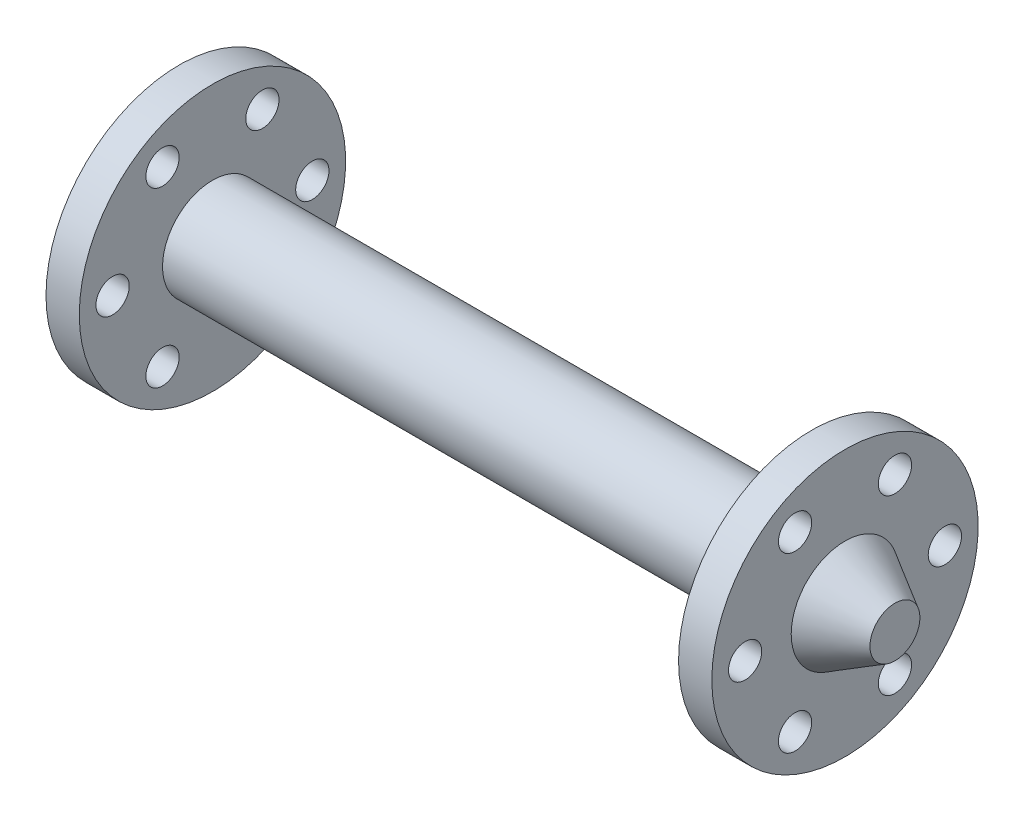
ISO-10303-21;
HEADER;
FILE_DESCRIPTION(('STEP AP214'),'2;1');
FILE_NAME('part.step','',(''),(''),'','','');
FILE_SCHEMA(('AUTOMOTIVE_DESIGN { 1 0 10303 214 1 1 1 1 }'));
ENDSEC;
DATA;
#1=APPLICATION_CONTEXT('core data for automotive mechanical design processes');
#2=APPLICATION_PROTOCOL_DEFINITION('international standard','automotive_design',2000,#1);
#3=PRODUCT_CONTEXT('',#1,'mechanical');
#4=PRODUCT('Part','Part','',(#3));
#5=PRODUCT_RELATED_PRODUCT_CATEGORY('part','',(#4));
#6=PRODUCT_DEFINITION_FORMATION('','',#4);
#7=PRODUCT_DEFINITION_CONTEXT('part definition',#1,'design');
#8=PRODUCT_DEFINITION('design','',#6,#7);
#9=PRODUCT_DEFINITION_SHAPE('','',#8);
#10=(LENGTH_UNIT() NAMED_UNIT(*) SI_UNIT(.MILLI.,.METRE.));
#11=(NAMED_UNIT(*) PLANE_ANGLE_UNIT() SI_UNIT($,.RADIAN.));
#12=(NAMED_UNIT(*) SI_UNIT($,.STERADIAN.) SOLID_ANGLE_UNIT());
#13=UNCERTAINTY_MEASURE_WITH_UNIT(LENGTH_MEASURE(1.E-05),#10,'distance_accuracy_value','');
#14=(GEOMETRIC_REPRESENTATION_CONTEXT(3) GLOBAL_UNCERTAINTY_ASSIGNED_CONTEXT((#13)) GLOBAL_UNIT_ASSIGNED_CONTEXT((#10,
#11,#12)) REPRESENTATION_CONTEXT('',''));
#15=CARTESIAN_POINT('',(0.,0.,0.));
#16=DIRECTION('',(0.,0.,1.));
#17=DIRECTION('',(1.,0.,0.));
#18=AXIS2_PLACEMENT_3D('',#15,#16,#17);
#19=CARTESIAN_POINT('',(-230.,0.,0.));
#20=DIRECTION('',(-1.,0.,0.));
#21=DIRECTION('',(0.,0.,1.));
#22=AXIS2_PLACEMENT_3D('',#19,#20,#21);
#23=PLANE('',#22);
#24=CARTESIAN_POINT('',(-230.,0.,0.));
#25=DIRECTION('',(-1.,0.,0.));
#26=DIRECTION('',(0.,0.,1.));
#27=AXIS2_PLACEMENT_3D('',#24,#25,#26);
#28=CIRCLE('',#27,15.);
#29=CARTESIAN_POINT('',(-230.,0.,15.));
#30=VERTEX_POINT('',#29);
#31=EDGE_CURVE('E10',#30,#30,#28,.T.);
#32=ORIENTED_EDGE('',*,*,#31,.T.);
#33=EDGE_LOOP('',(#32));
#34=FACE_BOUND('',#33,.T.);
#35=ADVANCED_FACE('F42',(#34),#23,.T.);
#36=CARTESIAN_POINT('',(-230.,0.,0.));
#37=DIRECTION('',(1.,0.,0.));
#38=DIRECTION('',(0.,0.,-1.));
#39=AXIS2_PLACEMENT_3D('',#36,#37,#38);
#40=CONICAL_SURFACE('',#39,15.,0.5235987755983);
#41=CARTESIAN_POINT('',(-199.996233933162,0.,0.));
#42=DIRECTION('',(-1.,0.,0.));
#43=DIRECTION('',(0.,0.,1.));
#44=AXIS2_PLACEMENT_3D('',#41,#42,#43);
#45=CIRCLE('',#44,32.3226824153916);
#46=CARTESIAN_POINT('',(-199.996233933162,0.,32.3226824153916));
#47=VERTEX_POINT('',#46);
#48=EDGE_CURVE('E50',#47,#47,#45,.T.);
#49=ORIENTED_EDGE('',*,*,#48,.T.);
#50=EDGE_LOOP('',(#49));
#51=FACE_BOUND('',#50,.T.);
#52=ORIENTED_EDGE('',*,*,#31,.F.);
#53=EDGE_LOOP('',(#52));
#54=FACE_BOUND('',#53,.T.);
#55=ADVANCED_FACE('F163',(#51,#54),#40,.T.);
#56=CARTESIAN_POINT('',(-199.996233933162,0.,0.));
#57=DIRECTION('',(-1.,0.,0.));
#58=DIRECTION('',(0.,0.,1.));
#59=AXIS2_PLACEMENT_3D('',#56,#57,#58);
#60=PLANE('',#59);
#61=CARTESIAN_POINT('',(-199.996233933162,0.,-60.));
#62=DIRECTION('',(-1.,0.,0.));
#63=DIRECTION('',(0.,0.,1.));
#64=AXIS2_PLACEMENT_3D('',#61,#62,#63);
#65=CIRCLE('',#64,10.);
#66=CARTESIAN_POINT('',(-199.996233933162,0.,-50.));
#67=VERTEX_POINT('',#66);
#68=EDGE_CURVE('E65',#67,#67,#65,.T.);
#69=ORIENTED_EDGE('',*,*,#68,.F.);
#70=EDGE_LOOP('',(#69));
#71=FACE_BOUND('',#70,.T.);
#72=CARTESIAN_POINT('',(-199.996233933162,-51.961524227066,-30.0000000000006));
#73=DIRECTION('',(-1.,0.,0.));
#74=DIRECTION('',(0.,0.,1.));
#75=AXIS2_PLACEMENT_3D('',#72,#73,#74);
#76=CIRCLE('',#75,10.);
#77=CARTESIAN_POINT('',(-199.996233933162,-51.961524227066,-20.0000000000006));
#78=VERTEX_POINT('',#77);
#79=EDGE_CURVE('E380',#78,#78,#76,.T.);
#80=ORIENTED_EDGE('',*,*,#79,.F.);
#81=EDGE_LOOP('',(#80));
#82=FACE_BOUND('',#81,.T.);
#83=CARTESIAN_POINT('',(-199.996233933162,-51.9615242270666,29.9999999999995));
#84=DIRECTION('',(-1.,0.,0.));
#85=DIRECTION('',(0.,0.,1.));
#86=AXIS2_PLACEMENT_3D('',#83,#84,#85);
#87=CIRCLE('',#86,10.);
#88=CARTESIAN_POINT('',(-199.996233933162,-51.9615242270666,39.9999999999995));
#89=VERTEX_POINT('',#88);
#90=EDGE_CURVE('E383',#89,#89,#87,.T.);
#91=ORIENTED_EDGE('',*,*,#90,.F.);
#92=EDGE_LOOP('',(#91));
#93=FACE_BOUND('',#92,.T.);
#94=CARTESIAN_POINT('',(-199.996233933162,-4.18977760661176E-13,60.));
#95=DIRECTION('',(-1.,0.,0.));
#96=DIRECTION('',(0.,0.,1.));
#97=AXIS2_PLACEMENT_3D('',#94,#95,#96);
#98=CIRCLE('',#97,10.);
#99=CARTESIAN_POINT('',(-199.996233933162,-4.18977760661176E-13,70.));
#100=VERTEX_POINT('',#99);
#101=EDGE_CURVE('E388',#100,#100,#98,.T.);
#102=ORIENTED_EDGE('',*,*,#101,.F.);
#103=EDGE_LOOP('',(#102));
#104=FACE_BOUND('',#103,.T.);
#105=CARTESIAN_POINT('',(-199.996233933162,51.9615242270662,30.0000000000002));
#106=DIRECTION('',(-1.,0.,0.));
#107=DIRECTION('',(0.,0.,1.));
#108=AXIS2_PLACEMENT_3D('',#105,#106,#107);
#109=CIRCLE('',#108,10.);
#110=CARTESIAN_POINT('',(-199.996233933162,51.9615242270662,40.0000000000002));
#111=VERTEX_POINT('',#110);
#112=EDGE_CURVE('E377',#111,#111,#109,.T.);
#113=ORIENTED_EDGE('',*,*,#112,.F.);
#114=EDGE_LOOP('',(#113));
#115=FACE_BOUND('',#114,.T.);
#116=CARTESIAN_POINT('',(-199.996233933162,51.9615242270664,-29.9999999999999));
#117=DIRECTION('',(-1.,0.,0.));
#118=DIRECTION('',(0.,0.,1.));
#119=AXIS2_PLACEMENT_3D('',#116,#117,#118);
#120=CIRCLE('',#119,10.);
#121=CARTESIAN_POINT('',(-199.996233933162,51.9615242270664,-19.9999999999999));
#122=VERTEX_POINT('',#121);
#123=EDGE_CURVE('E373',#122,#122,#120,.T.);
#124=ORIENTED_EDGE('',*,*,#123,.F.);
#125=EDGE_LOOP('',(#124));
#126=FACE_BOUND('',#125,.T.);
#127=CARTESIAN_POINT('',(-199.996233933162,0.,0.));
#128=DIRECTION('',(-1.,0.,0.));
#129=DIRECTION('',(0.,0.,1.));
#130=AXIS2_PLACEMENT_3D('',#127,#128,#129);
#131=CIRCLE('',#130,80.);
#132=CARTESIAN_POINT('',(-199.996233933162,0.,80.));
#133=VERTEX_POINT('',#132);
#134=EDGE_CURVE('E56',#133,#133,#131,.T.);
#135=ORIENTED_EDGE('',*,*,#134,.T.);
#136=EDGE_LOOP('',(#135));
#137=FACE_BOUND('',#136,.T.);
#138=ORIENTED_EDGE('',*,*,#48,.F.);
#139=EDGE_LOOP('',(#138));
#140=FACE_BOUND('',#139,.T.);
#141=ADVANCED_FACE('F146',(#71,#82,#93,#104,#115,#126,#137,#140),#60,.T.);
#142=CARTESIAN_POINT('',(-230.,0.,0.));
#143=DIRECTION('',(-1.,0.,0.));
#144=DIRECTION('',(0.,0.,1.));
#145=AXIS2_PLACEMENT_3D('',#142,#143,#144);
#146=CYLINDRICAL_SURFACE('',#145,80.);
#147=CARTESIAN_POINT('',(-179.996233933162,0.,0.));
#148=DIRECTION('',(-1.,0.,0.));
#149=DIRECTION('',(0.,0.,1.));
#150=AXIS2_PLACEMENT_3D('',#147,#148,#149);
#151=CIRCLE('',#150,80.);
#152=CARTESIAN_POINT('',(-179.996233933162,0.,80.));
#153=VERTEX_POINT('',#152);
#154=EDGE_CURVE('E139',#153,#153,#151,.T.);
#155=ORIENTED_EDGE('',*,*,#154,.T.);
#156=EDGE_LOOP('',(#155));
#157=FACE_BOUND('',#156,.T.);
#158=ORIENTED_EDGE('',*,*,#134,.F.);
#159=EDGE_LOOP('',(#158));
#160=FACE_BOUND('',#159,.T.);
#161=ADVANCED_FACE('F149',(#157,#160),#146,.T.);
#162=CARTESIAN_POINT('',(-179.996233933162,0.,0.));
#163=DIRECTION('',(1.,0.,0.));
#164=DIRECTION('',(0.,0.,-1.));
#165=AXIS2_PLACEMENT_3D('',#162,#163,#164);
#166=PLANE('',#165);
#167=CARTESIAN_POINT('',(-179.996233933162,0.,-60.));
#168=DIRECTION('',(1.,0.,0.));
#169=DIRECTION('',(0.,0.,-1.));
#170=AXIS2_PLACEMENT_3D('',#167,#168,#169);
#171=CIRCLE('',#170,10.);
#172=CARTESIAN_POINT('',(-179.996233933162,0.,-70.));
#173=VERTEX_POINT('',#172);
#174=EDGE_CURVE('E111',#173,#173,#171,.T.);
#175=ORIENTED_EDGE('',*,*,#174,.F.);
#176=EDGE_LOOP('',(#175));
#177=FACE_BOUND('',#176,.T.);
#178=CARTESIAN_POINT('',(-179.996233933162,-51.961524227066,-30.0000000000006));
#179=DIRECTION('',(1.,0.,0.));
#180=DIRECTION('',(0.,0.,-1.));
#181=AXIS2_PLACEMENT_3D('',#178,#179,#180);
#182=CIRCLE('',#181,10.);
#183=CARTESIAN_POINT('',(-179.996233933162,-51.961524227066,-40.0000000000006));
#184=VERTEX_POINT('',#183);
#185=EDGE_CURVE('E93',#184,#184,#182,.T.);
#186=ORIENTED_EDGE('',*,*,#185,.F.);
#187=EDGE_LOOP('',(#186));
#188=FACE_BOUND('',#187,.T.);
#189=CARTESIAN_POINT('',(-179.996233933162,-51.9615242270666,29.9999999999995));
#190=DIRECTION('',(1.,0.,0.));
#191=DIRECTION('',(0.,0.,-1.));
#192=AXIS2_PLACEMENT_3D('',#189,#190,#191);
#193=CIRCLE('',#192,10.);
#194=CARTESIAN_POINT('',(-179.996233933162,-51.9615242270666,19.9999999999995));
#195=VERTEX_POINT('',#194);
#196=EDGE_CURVE('E87',#195,#195,#193,.T.);
#197=ORIENTED_EDGE('',*,*,#196,.F.);
#198=EDGE_LOOP('',(#197));
#199=FACE_BOUND('',#198,.T.);
#200=CARTESIAN_POINT('',(-179.996233933162,-4.18977760661176E-13,60.));
#201=DIRECTION('',(1.,0.,0.));
#202=DIRECTION('',(0.,0.,-1.));
#203=AXIS2_PLACEMENT_3D('',#200,#201,#202);
#204=CIRCLE('',#203,10.);
#205=CARTESIAN_POINT('',(-179.996233933162,-4.18977760661176E-13,50.));
#206=VERTEX_POINT('',#205);
#207=EDGE_CURVE('E82',#206,#206,#204,.T.);
#208=ORIENTED_EDGE('',*,*,#207,.F.);
#209=EDGE_LOOP('',(#208));
#210=FACE_BOUND('',#209,.T.);
#211=CARTESIAN_POINT('',(-179.996233933162,51.9615242270662,30.0000000000002));
#212=DIRECTION('',(1.,0.,0.));
#213=DIRECTION('',(0.,0.,-1.));
#214=AXIS2_PLACEMENT_3D('',#211,#212,#213);
#215=CIRCLE('',#214,10.);
#216=CARTESIAN_POINT('',(-179.996233933162,51.9615242270662,20.0000000000002));
#217=VERTEX_POINT('',#216);
#218=EDGE_CURVE('E77',#217,#217,#215,.T.);
#219=ORIENTED_EDGE('',*,*,#218,.F.);
#220=EDGE_LOOP('',(#219));
#221=FACE_BOUND('',#220,.T.);
#222=CARTESIAN_POINT('',(-179.996233933162,51.9615242270664,-29.9999999999999));
#223=DIRECTION('',(1.,0.,0.));
#224=DIRECTION('',(0.,0.,-1.));
#225=AXIS2_PLACEMENT_3D('',#222,#223,#224);
#226=CIRCLE('',#225,10.);
#227=CARTESIAN_POINT('',(-179.996233933162,51.9615242270664,-39.9999999999999));
#228=VERTEX_POINT('',#227);
#229=EDGE_CURVE('E71',#228,#228,#226,.T.);
#230=ORIENTED_EDGE('',*,*,#229,.F.);
#231=EDGE_LOOP('',(#230));
#232=FACE_BOUND('',#231,.T.);
#233=CARTESIAN_POINT('',(-179.996233933162,0.,0.));
#234=DIRECTION('',(-1.,0.,0.));
#235=DIRECTION('',(0.,0.,1.));
#236=AXIS2_PLACEMENT_3D('',#233,#234,#235);
#237=CIRCLE('',#236,30.);
#238=CARTESIAN_POINT('',(-179.996233933162,0.,30.));
#239=VERTEX_POINT('',#238);
#240=EDGE_CURVE('E135',#239,#239,#237,.T.);
#241=ORIENTED_EDGE('',*,*,#240,.T.);
#242=EDGE_LOOP('',(#241));
#243=FACE_BOUND('',#242,.T.);
#244=ORIENTED_EDGE('',*,*,#154,.F.);
#245=EDGE_LOOP('',(#244));
#246=FACE_BOUND('',#245,.T.);
#247=ADVANCED_FACE('F151',(#177,#188,#199,#210,#221,#232,#243,#246),#166,.T.);
#248=CARTESIAN_POINT('',(-230.,0.,0.));
#249=DIRECTION('',(-1.,0.,0.));
#250=DIRECTION('',(0.,0.,1.));
#251=AXIS2_PLACEMENT_3D('',#248,#249,#250);
#252=CYLINDRICAL_SURFACE('',#251,30.);
#253=CARTESIAN_POINT('',(179.996233933162,0.,0.));
#254=DIRECTION('',(-1.,0.,0.));
#255=DIRECTION('',(0.,0.,1.));
#256=AXIS2_PLACEMENT_3D('',#253,#254,#255);
#257=CIRCLE('',#256,30.);
#258=CARTESIAN_POINT('',(179.996233933162,0.,30.));
#259=VERTEX_POINT('',#258);
#260=EDGE_CURVE('E131',#259,#259,#257,.T.);
#261=ORIENTED_EDGE('',*,*,#260,.T.);
#262=EDGE_LOOP('',(#261));
#263=FACE_BOUND('',#262,.T.);
#264=ORIENTED_EDGE('',*,*,#240,.F.);
#265=EDGE_LOOP('',(#264));
#266=FACE_BOUND('',#265,.T.);
#267=ADVANCED_FACE('F159',(#263,#266),#252,.T.);
#268=CARTESIAN_POINT('',(179.996233933162,0.,0.));
#269=DIRECTION('',(1.,0.,0.));
#270=DIRECTION('',(0.,0.,-1.));
#271=AXIS2_PLACEMENT_3D('',#268,#269,#270);
#272=PLANE('',#271);
#273=CARTESIAN_POINT('',(179.996233933162,0.,-60.));
#274=DIRECTION('',(1.,0.,0.));
#275=DIRECTION('',(0.,0.,-1.));
#276=AXIS2_PLACEMENT_3D('',#273,#274,#275);
#277=CIRCLE('',#276,10.);
#278=CARTESIAN_POINT('',(179.996233933162,0.,-70.));
#279=VERTEX_POINT('',#278);
#280=EDGE_CURVE('E107',#279,#279,#277,.T.);
#281=ORIENTED_EDGE('',*,*,#280,.T.);
#282=EDGE_LOOP('',(#281));
#283=FACE_BOUND('',#282,.T.);
#284=CARTESIAN_POINT('',(179.996233933162,-51.961524227066,-30.0000000000006));
#285=DIRECTION('',(1.,0.,0.));
#286=DIRECTION('',(0.,0.,-1.));
#287=AXIS2_PLACEMENT_3D('',#284,#285,#286);
#288=CIRCLE('',#287,10.);
#289=CARTESIAN_POINT('',(179.996233933162,-51.961524227066,-40.0000000000006));
#290=VERTEX_POINT('',#289);
#291=EDGE_CURVE('E86',#290,#290,#288,.T.);
#292=ORIENTED_EDGE('',*,*,#291,.T.);
#293=EDGE_LOOP('',(#292));
#294=FACE_BOUND('',#293,.T.);
#295=CARTESIAN_POINT('',(179.996233933162,-51.9615242270666,29.9999999999995));
#296=DIRECTION('',(1.,0.,0.));
#297=DIRECTION('',(0.,0.,-1.));
#298=AXIS2_PLACEMENT_3D('',#295,#296,#297);
#299=CIRCLE('',#298,10.);
#300=CARTESIAN_POINT('',(179.996233933162,-51.9615242270666,19.9999999999995));
#301=VERTEX_POINT('',#300);
#302=EDGE_CURVE('E81',#301,#301,#299,.T.);
#303=ORIENTED_EDGE('',*,*,#302,.T.);
#304=EDGE_LOOP('',(#303));
#305=FACE_BOUND('',#304,.T.);
#306=CARTESIAN_POINT('',(179.996233933162,-4.18977760661176E-13,60.));
#307=DIRECTION('',(1.,0.,0.));
#308=DIRECTION('',(0.,0.,-1.));
#309=AXIS2_PLACEMENT_3D('',#306,#307,#308);
#310=CIRCLE('',#309,10.);
#311=CARTESIAN_POINT('',(179.996233933162,-4.18977760661176E-13,50.));
#312=VERTEX_POINT('',#311);
#313=EDGE_CURVE('E76',#312,#312,#310,.T.);
#314=ORIENTED_EDGE('',*,*,#313,.T.);
#315=EDGE_LOOP('',(#314));
#316=FACE_BOUND('',#315,.T.);
#317=CARTESIAN_POINT('',(179.996233933162,51.9615242270662,30.0000000000002));
#318=DIRECTION('',(1.,0.,0.));
#319=DIRECTION('',(0.,0.,-1.));
#320=AXIS2_PLACEMENT_3D('',#317,#318,#319);
#321=CIRCLE('',#320,10.);
#322=CARTESIAN_POINT('',(179.996233933162,51.9615242270662,20.0000000000002));
#323=VERTEX_POINT('',#322);
#324=EDGE_CURVE('E70',#323,#323,#321,.T.);
#325=ORIENTED_EDGE('',*,*,#324,.T.);
#326=EDGE_LOOP('',(#325));
#327=FACE_BOUND('',#326,.T.);
#328=CARTESIAN_POINT('',(179.996233933162,51.9615242270664,-29.9999999999999));
#329=DIRECTION('',(1.,0.,0.));
#330=DIRECTION('',(0.,0.,-1.));
#331=AXIS2_PLACEMENT_3D('',#328,#329,#330);
#332=CIRCLE('',#331,10.);
#333=CARTESIAN_POINT('',(179.996233933162,51.9615242270664,-39.9999999999999));
#334=VERTEX_POINT('',#333);
#335=EDGE_CURVE('E64',#334,#334,#332,.T.);
#336=ORIENTED_EDGE('',*,*,#335,.T.);
#337=EDGE_LOOP('',(#336));
#338=FACE_BOUND('',#337,.T.);
#339=ORIENTED_EDGE('',*,*,#260,.F.);
#340=EDGE_LOOP('',(#339));
#341=FACE_BOUND('',#340,.T.);
#342=CARTESIAN_POINT('',(179.996233933162,0.,0.));
#343=DIRECTION('',(-1.,0.,0.));
#344=DIRECTION('',(0.,0.,1.));
#345=AXIS2_PLACEMENT_3D('',#342,#343,#344);
#346=CIRCLE('',#345,80.);
#347=CARTESIAN_POINT('',(179.996233933162,0.,80.));
#348=VERTEX_POINT('',#347);
#349=EDGE_CURVE('E127',#348,#348,#346,.T.);
#350=ORIENTED_EDGE('',*,*,#349,.T.);
#351=EDGE_LOOP('',(#350));
#352=FACE_BOUND('',#351,.T.);
#353=ADVANCED_FACE('F204',(#283,#294,#305,#316,#327,#338,#341,#352),#272,.F.);
#354=CARTESIAN_POINT('',(-230.,0.,0.));
#355=DIRECTION('',(-1.,0.,0.));
#356=DIRECTION('',(0.,0.,1.));
#357=AXIS2_PLACEMENT_3D('',#354,#355,#356);
#358=CYLINDRICAL_SURFACE('',#357,80.);
#359=ORIENTED_EDGE('',*,*,#349,.F.);
#360=EDGE_LOOP('',(#359));
#361=FACE_BOUND('',#360,.T.);
#362=CARTESIAN_POINT('',(199.996233933162,0.,0.));
#363=DIRECTION('',(-1.,0.,0.));
#364=DIRECTION('',(0.,0.,1.));
#365=AXIS2_PLACEMENT_3D('',#362,#363,#364);
#366=CIRCLE('',#365,80.);
#367=CARTESIAN_POINT('',(199.996233933162,0.,80.));
#368=VERTEX_POINT('',#367);
#369=EDGE_CURVE('E123',#368,#368,#366,.T.);
#370=ORIENTED_EDGE('',*,*,#369,.T.);
#371=EDGE_LOOP('',(#370));
#372=FACE_BOUND('',#371,.T.);
#373=ADVANCED_FACE('F214',(#361,#372),#358,.T.);
#374=CARTESIAN_POINT('',(199.996233933162,0.,0.));
#375=DIRECTION('',(-1.,0.,0.));
#376=DIRECTION('',(0.,0.,1.));
#377=AXIS2_PLACEMENT_3D('',#374,#375,#376);
#378=PLANE('',#377);
#379=CARTESIAN_POINT('',(199.996233933162,0.,-60.));
#380=DIRECTION('',(-1.,0.,0.));
#381=DIRECTION('',(0.,0.,1.));
#382=AXIS2_PLACEMENT_3D('',#379,#380,#381);
#383=CIRCLE('',#382,10.);
#384=CARTESIAN_POINT('',(199.996233933162,0.,-50.));
#385=VERTEX_POINT('',#384);
#386=EDGE_CURVE('E45',#385,#385,#383,.T.);
#387=ORIENTED_EDGE('',*,*,#386,.T.);
#388=EDGE_LOOP('',(#387));
#389=FACE_BOUND('',#388,.T.);
#390=CARTESIAN_POINT('',(199.996233933162,-51.961524227066,-30.0000000000006));
#391=DIRECTION('',(-1.,0.,0.));
#392=DIRECTION('',(0.,0.,1.));
#393=AXIS2_PLACEMENT_3D('',#390,#391,#392);
#394=CIRCLE('',#393,10.);
#395=CARTESIAN_POINT('',(199.996233933162,-51.961524227066,-20.0000000000006));
#396=VERTEX_POINT('',#395);
#397=EDGE_CURVE('E83',#396,#396,#394,.T.);
#398=ORIENTED_EDGE('',*,*,#397,.T.);
#399=EDGE_LOOP('',(#398));
#400=FACE_BOUND('',#399,.T.);
#401=CARTESIAN_POINT('',(199.996233933162,-51.9615242270666,29.9999999999995));
#402=DIRECTION('',(-1.,0.,0.));
#403=DIRECTION('',(0.,0.,1.));
#404=AXIS2_PLACEMENT_3D('',#401,#402,#403);
#405=CIRCLE('',#404,10.);
#406=CARTESIAN_POINT('',(199.996233933162,-51.9615242270666,39.9999999999995));
#407=VERTEX_POINT('',#406);
#408=EDGE_CURVE('E78',#407,#407,#405,.T.);
#409=ORIENTED_EDGE('',*,*,#408,.T.);
#410=EDGE_LOOP('',(#409));
#411=FACE_BOUND('',#410,.T.);
#412=CARTESIAN_POINT('',(199.996233933162,-4.18977760661176E-13,60.));
#413=DIRECTION('',(-1.,0.,0.));
#414=DIRECTION('',(0.,0.,1.));
#415=AXIS2_PLACEMENT_3D('',#412,#413,#414);
#416=CIRCLE('',#415,10.);
#417=CARTESIAN_POINT('',(199.996233933162,-4.18977760661176E-13,70.));
#418=VERTEX_POINT('',#417);
#419=EDGE_CURVE('E72',#418,#418,#416,.T.);
#420=ORIENTED_EDGE('',*,*,#419,.T.);
#421=EDGE_LOOP('',(#420));
#422=FACE_BOUND('',#421,.T.);
#423=CARTESIAN_POINT('',(199.996233933162,51.9615242270662,30.0000000000002));
#424=DIRECTION('',(-1.,0.,0.));
#425=DIRECTION('',(0.,0.,1.));
#426=AXIS2_PLACEMENT_3D('',#423,#424,#425);
#427=CIRCLE('',#426,10.);
#428=CARTESIAN_POINT('',(199.996233933162,51.9615242270662,40.0000000000002));
#429=VERTEX_POINT('',#428);
#430=EDGE_CURVE('E66',#429,#429,#427,.T.);
#431=ORIENTED_EDGE('',*,*,#430,.T.);
#432=EDGE_LOOP('',(#431));
#433=FACE_BOUND('',#432,.T.);
#434=CARTESIAN_POINT('',(199.996233933162,51.9615242270664,-29.9999999999999));
#435=DIRECTION('',(-1.,0.,0.));
#436=DIRECTION('',(0.,0.,1.));
#437=AXIS2_PLACEMENT_3D('',#434,#435,#436);
#438=CIRCLE('',#437,10.);
#439=CARTESIAN_POINT('',(199.996233933162,51.9615242270664,-19.9999999999999));
#440=VERTEX_POINT('',#439);
#441=EDGE_CURVE('E60',#440,#440,#438,.T.);
#442=ORIENTED_EDGE('',*,*,#441,.T.);
#443=EDGE_LOOP('',(#442));
#444=FACE_BOUND('',#443,.T.);
#445=ORIENTED_EDGE('',*,*,#369,.F.);
#446=EDGE_LOOP('',(#445));
#447=FACE_BOUND('',#446,.T.);
#448=CARTESIAN_POINT('',(199.996233933162,0.,0.));
#449=DIRECTION('',(-1.,0.,0.));
#450=DIRECTION('',(0.,0.,1.));
#451=AXIS2_PLACEMENT_3D('',#448,#449,#450);
#452=CIRCLE('',#451,32.3226824153916);
#453=CARTESIAN_POINT('',(199.996233933162,0.,32.3226824153916));
#454=VERTEX_POINT('',#453);
#455=EDGE_CURVE('E119',#454,#454,#452,.T.);
#456=ORIENTED_EDGE('',*,*,#455,.T.);
#457=EDGE_LOOP('',(#456));
#458=FACE_BOUND('',#457,.T.);
#459=ADVANCED_FACE('F224',(#389,#400,#411,#422,#433,#444,#447,#458),#378,.F.);
#460=CARTESIAN_POINT('',(230.,0.,0.));
#461=DIRECTION('',(-1.,0.,0.));
#462=DIRECTION('',(0.,0.,1.));
#463=AXIS2_PLACEMENT_3D('',#460,#461,#462);
#464=CONICAL_SURFACE('',#463,15.,0.523598775598299);
#465=ORIENTED_EDGE('',*,*,#455,.F.);
#466=EDGE_LOOP('',(#465));
#467=FACE_BOUND('',#466,.T.);
#468=CARTESIAN_POINT('',(230.,0.,0.));
#469=DIRECTION('',(-1.,0.,0.));
#470=DIRECTION('',(0.,0.,1.));
#471=AXIS2_PLACEMENT_3D('',#468,#469,#470);
#472=CIRCLE('',#471,15.);
#473=CARTESIAN_POINT('',(230.,0.,15.));
#474=VERTEX_POINT('',#473);
#475=EDGE_CURVE('E115',#474,#474,#472,.T.);
#476=ORIENTED_EDGE('',*,*,#475,.T.);
#477=EDGE_LOOP('',(#476));
#478=FACE_BOUND('',#477,.T.);
#479=ADVANCED_FACE('F234',(#467,#478),#464,.T.);
#480=CARTESIAN_POINT('',(230.,0.,0.));
#481=DIRECTION('',(-1.,0.,0.));
#482=DIRECTION('',(0.,0.,1.));
#483=AXIS2_PLACEMENT_3D('',#480,#481,#482);
#484=PLANE('',#483);
#485=ORIENTED_EDGE('',*,*,#475,.F.);
#486=EDGE_LOOP('',(#485));
#487=FACE_BOUND('',#486,.T.);
#488=ADVANCED_FACE('F244',(#487),#484,.F.);
#489=CARTESIAN_POINT('',(329.003766066838,51.9615242270664,-29.9999999999999));
#490=DIRECTION('',(-1.,0.,0.));
#491=DIRECTION('',(0.,0.,1.));
#492=AXIS2_PLACEMENT_3D('',#489,#490,#491);
#493=CYLINDRICAL_SURFACE('',#492,10.);
#494=ORIENTED_EDGE('',*,*,#441,.F.);
#495=EDGE_LOOP('',(#494));
#496=FACE_BOUND('',#495,.T.);
#497=ORIENTED_EDGE('',*,*,#335,.F.);
#498=EDGE_LOOP('',(#497));
#499=FACE_BOUND('',#498,.T.);
#500=ADVANCED_FACE('F253',(#496,#499),#493,.F.);
#501=CARTESIAN_POINT('',(329.003766066838,51.9615242270662,30.0000000000002));
#502=DIRECTION('',(-1.,0.,0.));
#503=DIRECTION('',(0.,0.,1.));
#504=AXIS2_PLACEMENT_3D('',#501,#502,#503);
#505=CYLINDRICAL_SURFACE('',#504,10.);
#506=ORIENTED_EDGE('',*,*,#430,.F.);
#507=EDGE_LOOP('',(#506));
#508=FACE_BOUND('',#507,.T.);
#509=ORIENTED_EDGE('',*,*,#324,.F.);
#510=EDGE_LOOP('',(#509));
#511=FACE_BOUND('',#510,.T.);
#512=ADVANCED_FACE('F262',(#508,#511),#505,.F.);
#513=CARTESIAN_POINT('',(329.003766066838,-4.18977760661176E-13,60.));
#514=DIRECTION('',(-1.,0.,0.));
#515=DIRECTION('',(0.,0.,1.));
#516=AXIS2_PLACEMENT_3D('',#513,#514,#515);
#517=CYLINDRICAL_SURFACE('',#516,10.);
#518=ORIENTED_EDGE('',*,*,#419,.F.);
#519=EDGE_LOOP('',(#518));
#520=FACE_BOUND('',#519,.T.);
#521=ORIENTED_EDGE('',*,*,#313,.F.);
#522=EDGE_LOOP('',(#521));
#523=FACE_BOUND('',#522,.T.);
#524=ADVANCED_FACE('F273',(#520,#523),#517,.F.);
#525=CARTESIAN_POINT('',(329.003766066838,-51.9615242270666,29.9999999999995));
#526=DIRECTION('',(-1.,0.,0.));
#527=DIRECTION('',(0.,0.,1.));
#528=AXIS2_PLACEMENT_3D('',#525,#526,#527);
#529=CYLINDRICAL_SURFACE('',#528,10.);
#530=ORIENTED_EDGE('',*,*,#408,.F.);
#531=EDGE_LOOP('',(#530));
#532=FACE_BOUND('',#531,.T.);
#533=ORIENTED_EDGE('',*,*,#302,.F.);
#534=EDGE_LOOP('',(#533));
#535=FACE_BOUND('',#534,.T.);
#536=ADVANCED_FACE('F284',(#532,#535),#529,.F.);
#537=CARTESIAN_POINT('',(329.003766066838,-51.961524227066,-30.0000000000006));
#538=DIRECTION('',(-1.,0.,0.));
#539=DIRECTION('',(0.,0.,1.));
#540=AXIS2_PLACEMENT_3D('',#537,#538,#539);
#541=CYLINDRICAL_SURFACE('',#540,10.);
#542=ORIENTED_EDGE('',*,*,#397,.F.);
#543=EDGE_LOOP('',(#542));
#544=FACE_BOUND('',#543,.T.);
#545=ORIENTED_EDGE('',*,*,#291,.F.);
#546=EDGE_LOOP('',(#545));
#547=FACE_BOUND('',#546,.T.);
#548=ADVANCED_FACE('F295',(#544,#547),#541,.F.);
#549=CARTESIAN_POINT('',(329.003766066838,0.,-60.));
#550=DIRECTION('',(-1.,0.,0.));
#551=DIRECTION('',(0.,0.,1.));
#552=AXIS2_PLACEMENT_3D('',#549,#550,#551);
#553=CYLINDRICAL_SURFACE('',#552,10.);
#554=ORIENTED_EDGE('',*,*,#386,.F.);
#555=EDGE_LOOP('',(#554));
#556=FACE_BOUND('',#555,.T.);
#557=ORIENTED_EDGE('',*,*,#280,.F.);
#558=EDGE_LOOP('',(#557));
#559=FACE_BOUND('',#558,.T.);
#560=ADVANCED_FACE('F306',(#556,#559),#553,.F.);
#561=ORIENTED_EDGE('',*,*,#229,.T.);
#562=EDGE_LOOP('',(#561));
#563=FACE_BOUND('',#562,.T.);
#564=ORIENTED_EDGE('',*,*,#123,.T.);
#565=EDGE_LOOP('',(#564));
#566=FACE_BOUND('',#565,.T.);
#567=ADVANCED_FACE('F265',(#563,#566),#493,.F.);
#568=ORIENTED_EDGE('',*,*,#218,.T.);
#569=EDGE_LOOP('',(#568));
#570=FACE_BOUND('',#569,.T.);
#571=ORIENTED_EDGE('',*,*,#112,.T.);
#572=EDGE_LOOP('',(#571));
#573=FACE_BOUND('',#572,.T.);
#574=ADVANCED_FACE('F276',(#570,#573),#505,.F.);
#575=ORIENTED_EDGE('',*,*,#207,.T.);
#576=EDGE_LOOP('',(#575));
#577=FACE_BOUND('',#576,.T.);
#578=ORIENTED_EDGE('',*,*,#101,.T.);
#579=EDGE_LOOP('',(#578));
#580=FACE_BOUND('',#579,.T.);
#581=ADVANCED_FACE('F287',(#577,#580),#517,.F.);
#582=ORIENTED_EDGE('',*,*,#196,.T.);
#583=EDGE_LOOP('',(#582));
#584=FACE_BOUND('',#583,.T.);
#585=ORIENTED_EDGE('',*,*,#90,.T.);
#586=EDGE_LOOP('',(#585));
#587=FACE_BOUND('',#586,.T.);
#588=ADVANCED_FACE('F298',(#584,#587),#529,.F.);
#589=ORIENTED_EDGE('',*,*,#185,.T.);
#590=EDGE_LOOP('',(#589));
#591=FACE_BOUND('',#590,.T.);
#592=ORIENTED_EDGE('',*,*,#79,.T.);
#593=EDGE_LOOP('',(#592));
#594=FACE_BOUND('',#593,.T.);
#595=ADVANCED_FACE('F309',(#591,#594),#541,.F.);
#596=ORIENTED_EDGE('',*,*,#174,.T.);
#597=EDGE_LOOP('',(#596));
#598=FACE_BOUND('',#597,.T.);
#599=ORIENTED_EDGE('',*,*,#68,.T.);
#600=EDGE_LOOP('',(#599));
#601=FACE_BOUND('',#600,.T.);
#602=ADVANCED_FACE('F319',(#598,#601),#553,.F.);
#603=CLOSED_SHELL('',(#35,#55,#141,#161,#247,#267,#353,#373,#459,#479,#488,#500,#512,#524,#536,
#548,#560,#567,#574,#581,#588,#595,#602));
#604=MANIFOLD_SOLID_BREP('B2',#603);
#605=ADVANCED_BREP_SHAPE_REPRESENTATION('',(#18,#604),#14);
#606=SHAPE_DEFINITION_REPRESENTATION(#9,#605);
ENDSEC;
END-ISO-10303-21;
